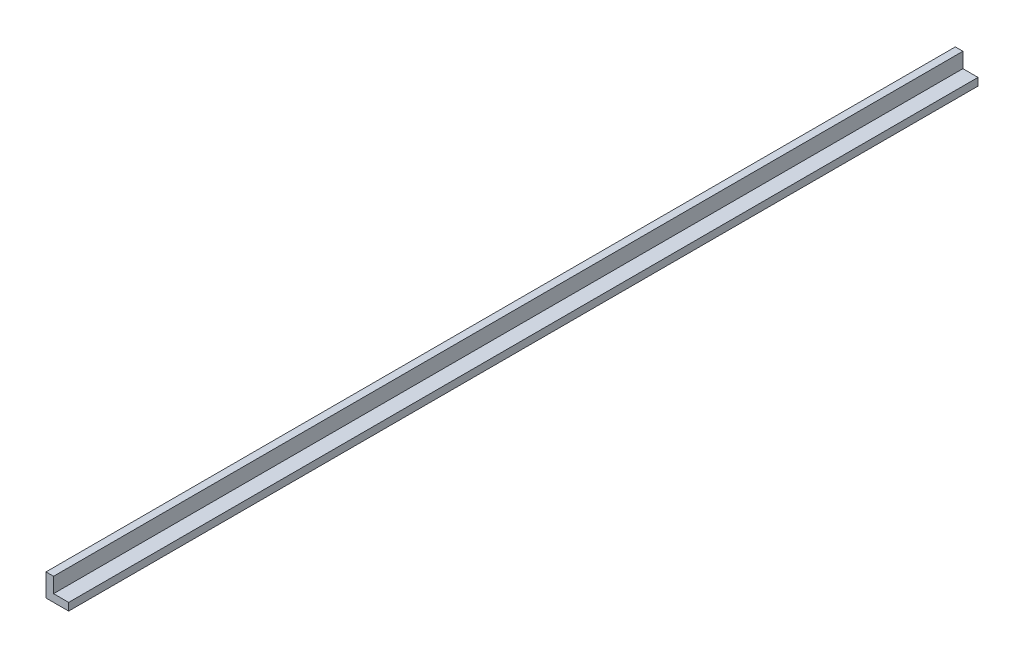
ISO-10303-21;
HEADER;
FILE_DESCRIPTION(('STEP AP214'),'2;1');
FILE_NAME('part.step','',(''),(''),'','','');
FILE_SCHEMA(('AUTOMOTIVE_DESIGN { 1 0 10303 214 1 1 1 1 }'));
ENDSEC;
DATA;
#1=APPLICATION_CONTEXT('core data for automotive mechanical design processes');
#2=APPLICATION_PROTOCOL_DEFINITION('international standard','automotive_design',2000,#1);
#3=PRODUCT_CONTEXT('',#1,'mechanical');
#4=PRODUCT('Part','Part','',(#3));
#5=PRODUCT_RELATED_PRODUCT_CATEGORY('part','',(#4));
#6=PRODUCT_DEFINITION_FORMATION('','',#4);
#7=PRODUCT_DEFINITION_CONTEXT('part definition',#1,'design');
#8=PRODUCT_DEFINITION('design','',#6,#7);
#9=PRODUCT_DEFINITION_SHAPE('','',#8);
#10=(LENGTH_UNIT() NAMED_UNIT(*) SI_UNIT(.MILLI.,.METRE.));
#11=(NAMED_UNIT(*) PLANE_ANGLE_UNIT() SI_UNIT($,.RADIAN.));
#12=(NAMED_UNIT(*) SI_UNIT($,.STERADIAN.) SOLID_ANGLE_UNIT());
#13=UNCERTAINTY_MEASURE_WITH_UNIT(LENGTH_MEASURE(1.E-05),#10,'distance_accuracy_value','');
#14=(GEOMETRIC_REPRESENTATION_CONTEXT(3) GLOBAL_UNCERTAINTY_ASSIGNED_CONTEXT((#13)) GLOBAL_UNIT_ASSIGNED_CONTEXT((#10,
#11,#12)) REPRESENTATION_CONTEXT('',''));
#15=CARTESIAN_POINT('',(0.,0.,0.));
#16=DIRECTION('',(0.,0.,1.));
#17=DIRECTION('',(1.,0.,0.));
#18=AXIS2_PLACEMENT_3D('',#15,#16,#17);
#19=CARTESIAN_POINT('',(50.8,152.,-6100.));
#20=DIRECTION('',(0.,1.,0.));
#21=DIRECTION('',(0.,0.,1.));
#22=AXIS2_PLACEMENT_3D('',#19,#20,#21);
#23=PLANE('',#22);
#24=DIRECTION('',(-1.,0.,0.));
#25=VECTOR('',#24,1.);
#26=CARTESIAN_POINT('',(50.8,152.,0.));
#27=LINE('',#26,#25);
#28=CARTESIAN_POINT('',(50.8,152.,0.));
#29=VERTEX_POINT('',#28);
#30=CARTESIAN_POINT('',(0.,152.,0.));
#31=VERTEX_POINT('',#30);
#32=EDGE_CURVE('E118',#29,#31,#27,.T.);
#33=ORIENTED_EDGE('',*,*,#32,.F.);
#34=DIRECTION('',(0.,0.,1.));
#35=VECTOR('',#34,1.);
#36=CARTESIAN_POINT('',(50.8,152.,-6100.));
#37=LINE('',#36,#35);
#38=CARTESIAN_POINT('',(50.8,152.,-6100.));
#39=VERTEX_POINT('',#38);
#40=EDGE_CURVE('E11',#39,#29,#37,.T.);
#41=ORIENTED_EDGE('',*,*,#40,.F.);
#42=DIRECTION('',(-1.,0.,0.));
#43=VECTOR('',#42,1.);
#44=CARTESIAN_POINT('',(50.8,152.,-6100.));
#45=LINE('',#44,#43);
#46=CARTESIAN_POINT('',(0.,152.,-6100.));
#47=VERTEX_POINT('',#46);
#48=EDGE_CURVE('E132',#39,#47,#45,.T.);
#49=ORIENTED_EDGE('',*,*,#48,.T.);
#50=DIRECTION('',(0.,0.,1.));
#51=VECTOR('',#50,1.);
#52=CARTESIAN_POINT('',(0.,152.,-6100.));
#53=LINE('',#52,#51);
#54=EDGE_CURVE('E36',#47,#31,#53,.T.);
#55=ORIENTED_EDGE('',*,*,#54,.T.);
#56=EDGE_LOOP('',(#33,#41,#49,#55));
#57=FACE_BOUND('',#56,.T.);
#58=ADVANCED_FACE('F33',(#57),#23,.T.);
#59=CARTESIAN_POINT('',(50.8,50.8,-6100.));
#60=DIRECTION('',(1.,0.,0.));
#61=DIRECTION('',(0.,1.,0.));
#62=AXIS2_PLACEMENT_3D('',#59,#60,#61);
#63=PLANE('',#62);
#64=DIRECTION('',(0.,1.,0.));
#65=VECTOR('',#64,1.);
#66=CARTESIAN_POINT('',(50.8,50.8,0.));
#67=LINE('',#66,#65);
#68=CARTESIAN_POINT('',(50.8,50.8,0.));
#69=VERTEX_POINT('',#68);
#70=EDGE_CURVE('E130',#69,#29,#67,.T.);
#71=ORIENTED_EDGE('',*,*,#70,.F.);
#72=DIRECTION('',(0.,0.,1.));
#73=VECTOR('',#72,1.);
#74=CARTESIAN_POINT('',(50.8,50.8,-6100.));
#75=LINE('',#74,#73);
#76=CARTESIAN_POINT('',(50.8,50.8,-6100.));
#77=VERTEX_POINT('',#76);
#78=EDGE_CURVE('E42',#77,#69,#75,.T.);
#79=ORIENTED_EDGE('',*,*,#78,.F.);
#80=DIRECTION('',(0.,1.,0.));
#81=VECTOR('',#80,1.);
#82=CARTESIAN_POINT('',(50.8,50.8,-6100.));
#83=LINE('',#82,#81);
#84=EDGE_CURVE('E108',#77,#39,#83,.T.);
#85=ORIENTED_EDGE('',*,*,#84,.T.);
#86=ORIENTED_EDGE('',*,*,#40,.T.);
#87=EDGE_LOOP('',(#71,#79,#85,#86));
#88=FACE_BOUND('',#87,.T.);
#89=ADVANCED_FACE('F140',(#88),#63,.T.);
#90=CARTESIAN_POINT('',(152.,50.8,-6100.));
#91=DIRECTION('',(0.,1.,0.));
#92=DIRECTION('',(-1.,0.,0.));
#93=AXIS2_PLACEMENT_3D('',#90,#91,#92);
#94=PLANE('',#93);
#95=DIRECTION('',(-1.,0.,0.));
#96=VECTOR('',#95,1.);
#97=CARTESIAN_POINT('',(152.,50.8,0.));
#98=LINE('',#97,#96);
#99=CARTESIAN_POINT('',(152.,50.8,0.));
#100=VERTEX_POINT('',#99);
#101=EDGE_CURVE('E95',#100,#69,#98,.T.);
#102=ORIENTED_EDGE('',*,*,#101,.F.);
#103=DIRECTION('',(0.,0.,1.));
#104=VECTOR('',#103,1.);
#105=CARTESIAN_POINT('',(152.,50.8,-6100.));
#106=LINE('',#105,#104);
#107=CARTESIAN_POINT('',(152.,50.8,-6100.));
#108=VERTEX_POINT('',#107);
#109=EDGE_CURVE('E90',#108,#100,#106,.T.);
#110=ORIENTED_EDGE('',*,*,#109,.F.);
#111=DIRECTION('',(-1.,0.,0.));
#112=VECTOR('',#111,1.);
#113=CARTESIAN_POINT('',(152.,50.8,-6100.));
#114=LINE('',#113,#112);
#115=EDGE_CURVE('E93',#108,#77,#114,.T.);
#116=ORIENTED_EDGE('',*,*,#115,.T.);
#117=ORIENTED_EDGE('',*,*,#78,.T.);
#118=EDGE_LOOP('',(#102,#110,#116,#117));
#119=FACE_BOUND('',#118,.T.);
#120=ADVANCED_FACE('F92',(#119),#94,.T.);
#121=CARTESIAN_POINT('',(152.,0.,-6100.));
#122=DIRECTION('',(1.,0.,0.));
#123=DIRECTION('',(0.,0.,-1.));
#124=AXIS2_PLACEMENT_3D('',#121,#122,#123);
#125=PLANE('',#124);
#126=DIRECTION('',(0.,1.,0.));
#127=VECTOR('',#126,1.);
#128=CARTESIAN_POINT('',(152.,0.,0.));
#129=LINE('',#128,#127);
#130=CARTESIAN_POINT('',(152.,0.,0.));
#131=VERTEX_POINT('',#130);
#132=EDGE_CURVE('E127',#131,#100,#129,.T.);
#133=ORIENTED_EDGE('',*,*,#132,.F.);
#134=DIRECTION('',(0.,0.,1.));
#135=VECTOR('',#134,1.);
#136=CARTESIAN_POINT('',(152.,0.,-6100.));
#137=LINE('',#136,#135);
#138=CARTESIAN_POINT('',(152.,0.,-6100.));
#139=VERTEX_POINT('',#138);
#140=EDGE_CURVE('E100',#139,#131,#137,.T.);
#141=ORIENTED_EDGE('',*,*,#140,.F.);
#142=DIRECTION('',(0.,1.,0.));
#143=VECTOR('',#142,1.);
#144=CARTESIAN_POINT('',(152.,0.,-6100.));
#145=LINE('',#144,#143);
#146=EDGE_CURVE('E106',#139,#108,#145,.T.);
#147=ORIENTED_EDGE('',*,*,#146,.T.);
#148=ORIENTED_EDGE('',*,*,#109,.T.);
#149=EDGE_LOOP('',(#133,#141,#147,#148));
#150=FACE_BOUND('',#149,.T.);
#151=ADVANCED_FACE('F110',(#150),#125,.T.);
#152=CARTESIAN_POINT('',(0.,0.,-6100.));
#153=DIRECTION('',(0.,-1.,0.));
#154=DIRECTION('',(0.,0.,-1.));
#155=AXIS2_PLACEMENT_3D('',#152,#153,#154);
#156=PLANE('',#155);
#157=DIRECTION('',(1.,0.,0.));
#158=VECTOR('',#157,1.);
#159=CARTESIAN_POINT('',(0.,0.,0.));
#160=LINE('',#159,#158);
#161=CARTESIAN_POINT('',(0.,0.,0.));
#162=VERTEX_POINT('',#161);
#163=EDGE_CURVE('E124',#162,#131,#160,.T.);
#164=ORIENTED_EDGE('',*,*,#163,.F.);
#165=DIRECTION('',(0.,0.,1.));
#166=VECTOR('',#165,1.);
#167=CARTESIAN_POINT('',(0.,0.,-6100.));
#168=LINE('',#167,#166);
#169=CARTESIAN_POINT('',(0.,0.,-6100.));
#170=VERTEX_POINT('',#169);
#171=EDGE_CURVE('E135',#170,#162,#168,.T.);
#172=ORIENTED_EDGE('',*,*,#171,.F.);
#173=DIRECTION('',(1.,0.,0.));
#174=VECTOR('',#173,1.);
#175=CARTESIAN_POINT('',(0.,0.,-6100.));
#176=LINE('',#175,#174);
#177=EDGE_CURVE('E111',#170,#139,#176,.T.);
#178=ORIENTED_EDGE('',*,*,#177,.T.);
#179=ORIENTED_EDGE('',*,*,#140,.T.);
#180=EDGE_LOOP('',(#164,#172,#178,#179));
#181=FACE_BOUND('',#180,.T.);
#182=ADVANCED_FACE('F153',(#181),#156,.T.);
#183=CARTESIAN_POINT('',(0.,152.,-6100.));
#184=DIRECTION('',(-1.,0.,0.));
#185=DIRECTION('',(0.,-1.,0.));
#186=AXIS2_PLACEMENT_3D('',#183,#184,#185);
#187=PLANE('',#186);
#188=DIRECTION('',(0.,-1.,0.));
#189=VECTOR('',#188,1.);
#190=CARTESIAN_POINT('',(0.,152.,0.));
#191=LINE('',#190,#189);
#192=EDGE_CURVE('E121',#31,#162,#191,.T.);
#193=ORIENTED_EDGE('',*,*,#192,.F.);
#194=ORIENTED_EDGE('',*,*,#54,.F.);
#195=DIRECTION('',(0.,-1.,0.));
#196=VECTOR('',#195,1.);
#197=CARTESIAN_POINT('',(0.,152.,-6100.));
#198=LINE('',#197,#196);
#199=EDGE_CURVE('E113',#47,#170,#198,.T.);
#200=ORIENTED_EDGE('',*,*,#199,.T.);
#201=ORIENTED_EDGE('',*,*,#171,.T.);
#202=EDGE_LOOP('',(#193,#194,#200,#201));
#203=FACE_BOUND('',#202,.T.);
#204=ADVANCED_FACE('F137',(#203),#187,.T.);
#205=CARTESIAN_POINT('',(0.,0.,-6100.));
#206=DIRECTION('',(0.,0.,1.));
#207=DIRECTION('',(1.,0.,0.));
#208=AXIS2_PLACEMENT_3D('',#205,#206,#207);
#209=PLANE('',#208);
#210=ORIENTED_EDGE('',*,*,#48,.F.);
#211=ORIENTED_EDGE('',*,*,#84,.F.);
#212=ORIENTED_EDGE('',*,*,#115,.F.);
#213=ORIENTED_EDGE('',*,*,#146,.F.);
#214=ORIENTED_EDGE('',*,*,#177,.F.);
#215=ORIENTED_EDGE('',*,*,#199,.F.);
#216=EDGE_LOOP('',(#210,#211,#212,#213,#214,#215));
#217=FACE_BOUND('',#216,.T.);
#218=ADVANCED_FACE('F104',(#217),#209,.F.);
#219=CARTESIAN_POINT('',(0.,0.,0.));
#220=DIRECTION('',(0.,0.,1.));
#221=DIRECTION('',(1.,0.,0.));
#222=AXIS2_PLACEMENT_3D('',#219,#220,#221);
#223=PLANE('',#222);
#224=ORIENTED_EDGE('',*,*,#32,.T.);
#225=ORIENTED_EDGE('',*,*,#192,.T.);
#226=ORIENTED_EDGE('',*,*,#163,.T.);
#227=ORIENTED_EDGE('',*,*,#132,.T.);
#228=ORIENTED_EDGE('',*,*,#101,.T.);
#229=ORIENTED_EDGE('',*,*,#70,.T.);
#230=EDGE_LOOP('',(#224,#225,#226,#227,#228,#229));
#231=FACE_BOUND('',#230,.T.);
#232=ADVANCED_FACE('F139',(#231),#223,.T.);
#233=CLOSED_SHELL('',(#58,#89,#120,#151,#182,#204,#218,#232));
#234=MANIFOLD_SOLID_BREP('B2',#233);
#235=ADVANCED_BREP_SHAPE_REPRESENTATION('',(#18,#234),#14);
#236=SHAPE_DEFINITION_REPRESENTATION(#9,#235);
ENDSEC;
END-ISO-10303-21;
